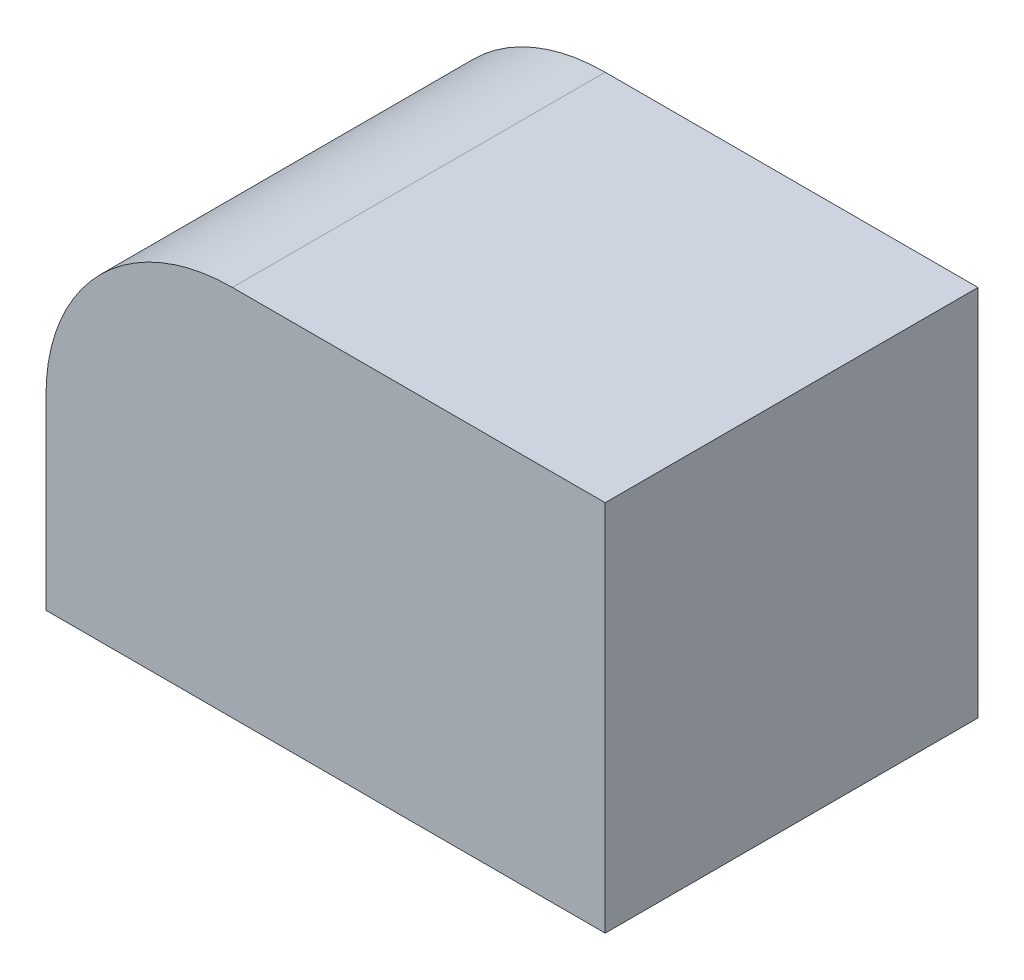
ISO-10303-21;
HEADER;
FILE_DESCRIPTION(('STEP AP214'),'2;1');
FILE_NAME('part.step','',(''),(''),'','','');
FILE_SCHEMA(('AUTOMOTIVE_DESIGN { 1 0 10303 214 1 1 1 1 }'));
ENDSEC;
DATA;
#1=APPLICATION_CONTEXT('core data for automotive mechanical design processes');
#2=APPLICATION_PROTOCOL_DEFINITION('international standard','automotive_design',2000,#1);
#3=PRODUCT_CONTEXT('',#1,'mechanical');
#4=PRODUCT('Part','Part','',(#3));
#5=PRODUCT_RELATED_PRODUCT_CATEGORY('part','',(#4));
#6=PRODUCT_DEFINITION_FORMATION('','',#4);
#7=PRODUCT_DEFINITION_CONTEXT('part definition',#1,'design');
#8=PRODUCT_DEFINITION('design','',#6,#7);
#9=PRODUCT_DEFINITION_SHAPE('','',#8);
#10=(LENGTH_UNIT() NAMED_UNIT(*) SI_UNIT(.MILLI.,.METRE.));
#11=(NAMED_UNIT(*) PLANE_ANGLE_UNIT() SI_UNIT($,.RADIAN.));
#12=(NAMED_UNIT(*) SI_UNIT($,.STERADIAN.) SOLID_ANGLE_UNIT());
#13=UNCERTAINTY_MEASURE_WITH_UNIT(LENGTH_MEASURE(1.E-05),#10,'distance_accuracy_value','');
#14=(GEOMETRIC_REPRESENTATION_CONTEXT(3) GLOBAL_UNCERTAINTY_ASSIGNED_CONTEXT((#13)) GLOBAL_UNIT_ASSIGNED_CONTEXT((#10,
#11,#12)) REPRESENTATION_CONTEXT('',''));
#15=CARTESIAN_POINT('',(0.,0.,0.));
#16=DIRECTION('',(0.,0.,1.));
#17=DIRECTION('',(1.,0.,0.));
#18=AXIS2_PLACEMENT_3D('',#15,#16,#17);
#19=CARTESIAN_POINT('',(-30.,40.,20.));
#20=DIRECTION('',(1.,0.,0.));
#21=DIRECTION('',(0.,0.,-1.));
#22=AXIS2_PLACEMENT_3D('',#19,#20,#21);
#23=PLANE('',#22);
#24=DIRECTION('',(0.,-1.,0.));
#25=VECTOR('',#24,1.);
#26=CARTESIAN_POINT('',(-30.,40.,20.));
#27=LINE('',#26,#25);
#28=CARTESIAN_POINT('',(-30.,20.,20.));
#29=VERTEX_POINT('',#28);
#30=CARTESIAN_POINT('',(-30.,0.,20.));
#31=VERTEX_POINT('',#30);
#32=EDGE_CURVE('E104',#29,#31,#27,.T.);
#33=ORIENTED_EDGE('',*,*,#32,.F.);
#34=DIRECTION('',(0.,0.,1.));
#35=VECTOR('',#34,1.);
#36=CARTESIAN_POINT('',(-30.,20.,-20.));
#37=LINE('',#36,#35);
#38=CARTESIAN_POINT('',(-30.,20.,-20.));
#39=VERTEX_POINT('',#38);
#40=EDGE_CURVE('E48',#29,#39,#37,.F.);
#41=ORIENTED_EDGE('',*,*,#40,.T.);
#42=DIRECTION('',(0.,-1.,0.));
#43=VECTOR('',#42,1.);
#44=CARTESIAN_POINT('',(-30.,40.,-20.));
#45=LINE('',#44,#43);
#46=CARTESIAN_POINT('',(-30.,0.,-20.));
#47=VERTEX_POINT('',#46);
#48=EDGE_CURVE('E114',#39,#47,#45,.T.);
#49=ORIENTED_EDGE('',*,*,#48,.T.);
#50=DIRECTION('',(0.,0.,1.));
#51=VECTOR('',#50,1.);
#52=CARTESIAN_POINT('',(-30.,0.,20.));
#53=LINE('',#52,#51);
#54=EDGE_CURVE('E117',#47,#31,#53,.T.);
#55=ORIENTED_EDGE('',*,*,#54,.T.);
#56=EDGE_LOOP('',(#33,#41,#49,#55));
#57=FACE_BOUND('',#56,.T.);
#58=ADVANCED_FACE('F39',(#57),#23,.F.);
#59=CARTESIAN_POINT('',(30.,40.,20.));
#60=DIRECTION('',(0.,0.,-1.));
#61=DIRECTION('',(-1.,0.,0.));
#62=AXIS2_PLACEMENT_3D('',#59,#60,#61);
#63=PLANE('',#62);
#64=DIRECTION('',(1.,0.,0.));
#65=VECTOR('',#64,1.);
#66=CARTESIAN_POINT('',(30.,40.,20.));
#67=LINE('',#66,#65);
#68=CARTESIAN_POINT('',(-9.99999999999999,40.,20.));
#69=VERTEX_POINT('',#68);
#70=CARTESIAN_POINT('',(30.,40.,20.));
#71=VERTEX_POINT('',#70);
#72=EDGE_CURVE('E84',#69,#71,#67,.T.);
#73=ORIENTED_EDGE('',*,*,#72,.F.);
#74=CARTESIAN_POINT('',(-9.99999999999999,20.,20.));
#75=DIRECTION('',(0.,0.,-1.));
#76=DIRECTION('',(-1.,0.,0.));
#77=AXIS2_PLACEMENT_3D('',#74,#75,#76);
#78=CIRCLE('',#77,20.);
#79=EDGE_CURVE('E62',#69,#29,#78,.F.);
#80=ORIENTED_EDGE('',*,*,#79,.T.);
#81=ORIENTED_EDGE('',*,*,#32,.T.);
#82=DIRECTION('',(1.,0.,0.));
#83=VECTOR('',#82,1.);
#84=CARTESIAN_POINT('',(30.,0.,20.));
#85=LINE('',#84,#83);
#86=CARTESIAN_POINT('',(30.,0.,20.));
#87=VERTEX_POINT('',#86);
#88=EDGE_CURVE('E100',#31,#87,#85,.T.);
#89=ORIENTED_EDGE('',*,*,#88,.T.);
#90=DIRECTION('',(0.,-1.,0.));
#91=VECTOR('',#90,1.);
#92=CARTESIAN_POINT('',(30.,40.,20.));
#93=LINE('',#92,#91);
#94=EDGE_CURVE('E97',#71,#87,#93,.T.);
#95=ORIENTED_EDGE('',*,*,#94,.F.);
#96=EDGE_LOOP('',(#73,#80,#81,#89,#95));
#97=FACE_BOUND('',#96,.T.);
#98=ADVANCED_FACE('F98',(#97),#63,.F.);
#99=CARTESIAN_POINT('',(30.,40.,20.));
#100=DIRECTION('',(-1.,0.,0.));
#101=DIRECTION('',(0.,0.,1.));
#102=AXIS2_PLACEMENT_3D('',#99,#100,#101);
#103=PLANE('',#102);
#104=DIRECTION('',(0.,0.,-1.));
#105=VECTOR('',#104,1.);
#106=CARTESIAN_POINT('',(30.,0.,20.));
#107=LINE('',#106,#105);
#108=CARTESIAN_POINT('',(30.,0.,-20.));
#109=VERTEX_POINT('',#108);
#110=EDGE_CURVE('E123',#87,#109,#107,.T.);
#111=ORIENTED_EDGE('',*,*,#110,.T.);
#112=DIRECTION('',(0.,-1.,0.));
#113=VECTOR('',#112,1.);
#114=CARTESIAN_POINT('',(30.,40.,-20.));
#115=LINE('',#114,#113);
#116=CARTESIAN_POINT('',(30.,40.,-20.));
#117=VERTEX_POINT('',#116);
#118=EDGE_CURVE('E105',#117,#109,#115,.T.);
#119=ORIENTED_EDGE('',*,*,#118,.F.);
#120=DIRECTION('',(0.,0.,-1.));
#121=VECTOR('',#120,1.);
#122=CARTESIAN_POINT('',(30.,40.,20.));
#123=LINE('',#122,#121);
#124=EDGE_CURVE('E89',#71,#117,#123,.T.);
#125=ORIENTED_EDGE('',*,*,#124,.F.);
#126=ORIENTED_EDGE('',*,*,#94,.T.);
#127=EDGE_LOOP('',(#111,#119,#125,#126));
#128=FACE_BOUND('',#127,.T.);
#129=ADVANCED_FACE('F107',(#128),#103,.F.);
#130=CARTESIAN_POINT('',(30.,40.,-20.));
#131=DIRECTION('',(0.,0.,1.));
#132=DIRECTION('',(1.,0.,0.));
#133=AXIS2_PLACEMENT_3D('',#130,#131,#132);
#134=PLANE('',#133);
#135=ORIENTED_EDGE('',*,*,#48,.F.);
#136=CARTESIAN_POINT('',(-9.99999999999999,20.,-20.));
#137=DIRECTION('',(0.,0.,1.));
#138=DIRECTION('',(1.,0.,0.));
#139=AXIS2_PLACEMENT_3D('',#136,#137,#138);
#140=CIRCLE('',#139,20.);
#141=CARTESIAN_POINT('',(-9.99999999999999,40.,-20.));
#142=VERTEX_POINT('',#141);
#143=EDGE_CURVE('E11',#39,#142,#140,.F.);
#144=ORIENTED_EDGE('',*,*,#143,.T.);
#145=DIRECTION('',(-1.,0.,0.));
#146=VECTOR('',#145,1.);
#147=CARTESIAN_POINT('',(30.,40.,-20.));
#148=LINE('',#147,#146);
#149=EDGE_CURVE('E111',#117,#142,#148,.T.);
#150=ORIENTED_EDGE('',*,*,#149,.F.);
#151=ORIENTED_EDGE('',*,*,#118,.T.);
#152=DIRECTION('',(-1.,0.,0.));
#153=VECTOR('',#152,1.);
#154=CARTESIAN_POINT('',(30.,0.,-20.));
#155=LINE('',#154,#153);
#156=EDGE_CURVE('E94',#109,#47,#155,.T.);
#157=ORIENTED_EDGE('',*,*,#156,.T.);
#158=EDGE_LOOP('',(#135,#144,#150,#151,#157));
#159=FACE_BOUND('',#158,.T.);
#160=ADVANCED_FACE('F145',(#159),#134,.F.);
#161=CARTESIAN_POINT('',(0.,40.,0.));
#162=DIRECTION('',(0.,1.,0.));
#163=DIRECTION('',(0.,0.,1.));
#164=AXIS2_PLACEMENT_3D('',#161,#162,#163);
#165=PLANE('',#164);
#166=ORIENTED_EDGE('',*,*,#149,.T.);
#167=DIRECTION('',(0.,0.,1.));
#168=VECTOR('',#167,1.);
#169=CARTESIAN_POINT('',(-9.99999999999999,40.,20.));
#170=LINE('',#169,#168);
#171=EDGE_CURVE('E92',#142,#69,#170,.T.);
#172=ORIENTED_EDGE('',*,*,#171,.T.);
#173=ORIENTED_EDGE('',*,*,#72,.T.);
#174=ORIENTED_EDGE('',*,*,#124,.T.);
#175=EDGE_LOOP('',(#166,#172,#173,#174));
#176=FACE_BOUND('',#175,.T.);
#177=ADVANCED_FACE('F87',(#176),#165,.T.);
#178=CARTESIAN_POINT('',(0.,0.,0.));
#179=DIRECTION('',(0.,1.,0.));
#180=DIRECTION('',(0.,0.,1.));
#181=AXIS2_PLACEMENT_3D('',#178,#179,#180);
#182=PLANE('',#181);
#183=ORIENTED_EDGE('',*,*,#54,.F.);
#184=ORIENTED_EDGE('',*,*,#156,.F.);
#185=ORIENTED_EDGE('',*,*,#110,.F.);
#186=ORIENTED_EDGE('',*,*,#88,.F.);
#187=EDGE_LOOP('',(#183,#184,#185,#186));
#188=FACE_BOUND('',#187,.T.);
#189=ADVANCED_FACE('F141',(#188),#182,.F.);
#190=CARTESIAN_POINT('',(-9.99999999999999,20.,0.));
#191=DIRECTION('',(0.,0.,-1.));
#192=DIRECTION('',(-1.,0.,0.));
#193=AXIS2_PLACEMENT_3D('',#190,#191,#192);
#194=CYLINDRICAL_SURFACE('',#193,20.);
#195=ORIENTED_EDGE('',*,*,#143,.F.);
#196=ORIENTED_EDGE('',*,*,#40,.F.);
#197=ORIENTED_EDGE('',*,*,#79,.F.);
#198=ORIENTED_EDGE('',*,*,#171,.F.);
#199=EDGE_LOOP('',(#195,#196,#197,#198));
#200=FACE_BOUND('',#199,.T.);
#201=ADVANCED_FACE('F41',(#200),#194,.T.);
#202=CLOSED_SHELL('',(#58,#98,#129,#160,#177,#189,#201));
#203=MANIFOLD_SOLID_BREP('B2',#202);
#204=ADVANCED_BREP_SHAPE_REPRESENTATION('',(#18,#203),#14);
#205=SHAPE_DEFINITION_REPRESENTATION(#9,#204);
ENDSEC;
END-ISO-10303-21;
